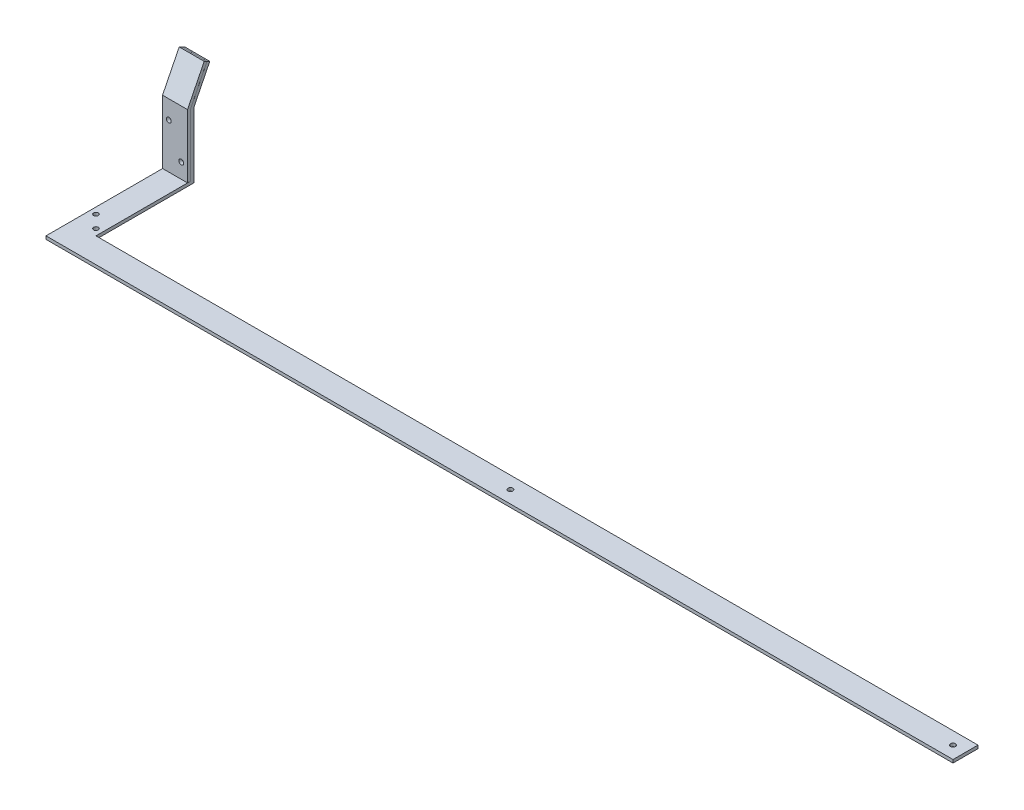
ISO-10303-21;
HEADER;
FILE_DESCRIPTION(('STEP AP214'),'2;1');
FILE_NAME('part.step','',(''),(''),'','','');
FILE_SCHEMA(('AUTOMOTIVE_DESIGN { 1 0 10303 214 1 1 1 1 }'));
ENDSEC;
DATA;
#1=APPLICATION_CONTEXT('core data for automotive mechanical design processes');
#2=APPLICATION_PROTOCOL_DEFINITION('international standard','automotive_design',2000,#1);
#3=PRODUCT_CONTEXT('',#1,'mechanical');
#4=PRODUCT('Part','Part','',(#3));
#5=PRODUCT_RELATED_PRODUCT_CATEGORY('part','',(#4));
#6=PRODUCT_DEFINITION_FORMATION('','',#4);
#7=PRODUCT_DEFINITION_CONTEXT('part definition',#1,'design');
#8=PRODUCT_DEFINITION('design','',#6,#7);
#9=PRODUCT_DEFINITION_SHAPE('','',#8);
#10=(LENGTH_UNIT() NAMED_UNIT(*) SI_UNIT(.MILLI.,.METRE.));
#11=(NAMED_UNIT(*) PLANE_ANGLE_UNIT() SI_UNIT($,.RADIAN.));
#12=(NAMED_UNIT(*) SI_UNIT($,.STERADIAN.) SOLID_ANGLE_UNIT());
#13=UNCERTAINTY_MEASURE_WITH_UNIT(LENGTH_MEASURE(1.E-05),#10,'distance_accuracy_value','');
#14=(GEOMETRIC_REPRESENTATION_CONTEXT(3) GLOBAL_UNCERTAINTY_ASSIGNED_CONTEXT((#13)) GLOBAL_UNIT_ASSIGNED_CONTEXT((#10,
#11,#12)) REPRESENTATION_CONTEXT('',''));
#15=CARTESIAN_POINT('',(0.,0.,0.));
#16=DIRECTION('',(0.,0.,1.));
#17=DIRECTION('',(1.,0.,0.));
#18=AXIS2_PLACEMENT_3D('',#15,#16,#17);
#19=CARTESIAN_POINT('',(2.08166817117217E-13,134.059354645728,6.40999999999998));
#20=DIRECTION('',(0.,-0.44619781310981,-0.894934361602024));
#21=DIRECTION('',(0.,0.894934361602024,-0.44619781310981));
#22=AXIS2_PLACEMENT_3D('',#19,#20,#21);
#23=PLANE('',#22);
#24=DIRECTION('',(0.,-0.894934361602024,0.44619781310981));
#25=VECTOR('',#24,1.);
#26=CARTESIAN_POINT('',(-50.7999999999998,134.059354645728,6.40999999999998));
#27=LINE('',#26,#25);
#28=CARTESIAN_POINT('',(-50.7999999999998,200.740336378982,-26.8359110991472));
#29=VERTEX_POINT('',#28);
#30=CARTESIAN_POINT('',(-50.7999999999998,134.059354645728,6.40999999999998));
#31=VERTEX_POINT('',#30);
#32=EDGE_CURVE('E129',#29,#31,#27,.T.);
#33=ORIENTED_EDGE('',*,*,#32,.F.);
#34=DIRECTION('',(-1.,0.,0.));
#35=VECTOR('',#34,1.);
#36=CARTESIAN_POINT('',(2.08166817117217E-13,200.740336378982,-26.8359110991472));
#37=LINE('',#36,#35);
#38=CARTESIAN_POINT('',(2.08166817117217E-13,200.740336378982,-26.8359110991472));
#39=VERTEX_POINT('',#38);
#40=EDGE_CURVE('E12',#39,#29,#37,.T.);
#41=ORIENTED_EDGE('',*,*,#40,.F.);
#42=DIRECTION('',(0.,-0.894934361602024,0.44619781310981));
#43=VECTOR('',#42,1.);
#44=CARTESIAN_POINT('',(2.08166817117217E-13,134.059354645728,6.40999999999998));
#45=LINE('',#44,#43);
#46=CARTESIAN_POINT('',(2.08166817117217E-13,134.059354645728,6.40999999999998));
#47=VERTEX_POINT('',#46);
#48=EDGE_CURVE('E143',#39,#47,#45,.T.);
#49=ORIENTED_EDGE('',*,*,#48,.T.);
#50=DIRECTION('',(-1.,0.,0.));
#51=VECTOR('',#50,1.);
#52=CARTESIAN_POINT('',(2.08166817117217E-13,134.059354645728,6.40999999999998));
#53=LINE('',#52,#51);
#54=EDGE_CURVE('E93',#47,#31,#53,.T.);
#55=ORIENTED_EDGE('',*,*,#54,.T.);
#56=EDGE_LOOP('',(#33,#41,#49,#55));
#57=FACE_BOUND('',#56,.T.);
#58=ADVANCED_FACE('F43',(#57),#23,.T.);
#59=CARTESIAN_POINT('',(2.08166817117217E-13,200.740336378982,-26.8359110991472));
#60=DIRECTION('',(0.,0.894934361602024,-0.446197813109811));
#61=DIRECTION('',(0.,0.446197813109811,0.894934361602024));
#62=AXIS2_PLACEMENT_3D('',#59,#60,#61);
#63=PLANE('',#62);
#64=DIRECTION('',(0.,-0.446197813109811,-0.894934361602024));
#65=VECTOR('',#64,1.);
#66=CARTESIAN_POINT('',(-50.7999999999998,200.740336378982,-26.8359110991472));
#67=LINE('',#66,#65);
#68=CARTESIAN_POINT('',(-50.7999999999998,203.555844579705,-21.1888752774384));
#69=VERTEX_POINT('',#68);
#70=EDGE_CURVE('E141',#69,#29,#67,.T.);
#71=ORIENTED_EDGE('',*,*,#70,.F.);
#72=DIRECTION('',(-1.,0.,0.));
#73=VECTOR('',#72,1.);
#74=CARTESIAN_POINT('',(2.08166817117217E-13,203.555844579705,-21.1888752774384));
#75=LINE('',#74,#73);
#76=CARTESIAN_POINT('',(2.08166817117217E-13,203.555844579705,-21.1888752774384));
#77=VERTEX_POINT('',#76);
#78=EDGE_CURVE('E52',#77,#69,#75,.T.);
#79=ORIENTED_EDGE('',*,*,#78,.F.);
#80=DIRECTION('',(0.,-0.446197813109811,-0.894934361602024));
#81=VECTOR('',#80,1.);
#82=CARTESIAN_POINT('',(2.08166817117217E-13,200.740336378982,-26.8359110991472));
#83=LINE('',#82,#81);
#84=EDGE_CURVE('E119',#77,#39,#83,.T.);
#85=ORIENTED_EDGE('',*,*,#84,.T.);
#86=ORIENTED_EDGE('',*,*,#40,.T.);
#87=EDGE_LOOP('',(#71,#79,#85,#86));
#88=FACE_BOUND('',#87,.T.);
#89=ADVANCED_FACE('F167',(#88),#63,.T.);
#90=CARTESIAN_POINT('',(2.08166817117217E-13,135.545162417108,12.72));
#91=DIRECTION('',(0.,0.44619781310981,0.894934361602024));
#92=DIRECTION('',(0.,-0.894934361602024,0.44619781310981));
#93=AXIS2_PLACEMENT_3D('',#90,#91,#92);
#94=PLANE('',#93);
#95=DIRECTION('',(0.,0.894934361602024,-0.44619781310981));
#96=VECTOR('',#95,1.);
#97=CARTESIAN_POINT('',(-50.7999999999998,135.545162417108,12.72));
#98=LINE('',#97,#96);
#99=CARTESIAN_POINT('',(-50.7999999999998,135.545162417108,12.72));
#100=VERTEX_POINT('',#99);
#101=EDGE_CURVE('E106',#100,#69,#98,.T.);
#102=ORIENTED_EDGE('',*,*,#101,.F.);
#103=DIRECTION('',(-1.,0.,0.));
#104=VECTOR('',#103,1.);
#105=CARTESIAN_POINT('',(2.08166817117217E-13,135.545162417108,12.72));
#106=LINE('',#105,#104);
#107=CARTESIAN_POINT('',(2.08166817117217E-13,135.545162417108,12.72));
#108=VERTEX_POINT('',#107);
#109=EDGE_CURVE('E101',#108,#100,#106,.T.);
#110=ORIENTED_EDGE('',*,*,#109,.F.);
#111=DIRECTION('',(0.,0.894934361602024,-0.44619781310981));
#112=VECTOR('',#111,1.);
#113=CARTESIAN_POINT('',(2.08166817117217E-13,135.545162417108,12.72));
#114=LINE('',#113,#112);
#115=EDGE_CURVE('E104',#108,#77,#114,.T.);
#116=ORIENTED_EDGE('',*,*,#115,.T.);
#117=ORIENTED_EDGE('',*,*,#78,.T.);
#118=EDGE_LOOP('',(#102,#110,#116,#117));
#119=FACE_BOUND('',#118,.T.);
#120=ADVANCED_FACE('F103',(#119),#94,.T.);
#121=CARTESIAN_POINT('',(2.08166817117217E-13,6.41,12.72));
#122=DIRECTION('',(0.,0.,1.));
#123=DIRECTION('',(0.,-1.,0.));
#124=AXIS2_PLACEMENT_3D('',#121,#122,#123);
#125=PLANE('',#124);
#126=CARTESIAN_POINT('',(-38.0999999999998,98.1,12.72));
#127=DIRECTION('',(0.,0.,1.));
#128=DIRECTION('',(1.,0.,0.));
#129=AXIS2_PLACEMENT_3D('',#126,#127,#128);
#130=CIRCLE('',#129,5.);
#131=CARTESIAN_POINT('',(-33.0999999999998,98.1,12.72));
#132=VERTEX_POINT('',#131);
#133=EDGE_CURVE('E151',#132,#132,#130,.T.);
#134=ORIENTED_EDGE('',*,*,#133,.F.);
#135=EDGE_LOOP('',(#134));
#136=FACE_BOUND('',#135,.T.);
#137=CARTESIAN_POINT('',(-12.6999999999998,36.91,12.72));
#138=DIRECTION('',(0.,0.,1.));
#139=DIRECTION('',(1.,0.,0.));
#140=AXIS2_PLACEMENT_3D('',#137,#138,#139);
#141=CIRCLE('',#140,5.);
#142=CARTESIAN_POINT('',(-7.69999999999979,36.91,12.72));
#143=VERTEX_POINT('',#142);
#144=EDGE_CURVE('E156',#143,#143,#141,.T.);
#145=ORIENTED_EDGE('',*,*,#144,.F.);
#146=EDGE_LOOP('',(#145));
#147=FACE_BOUND('',#146,.T.);
#148=DIRECTION('',(0.,1.,0.));
#149=VECTOR('',#148,1.);
#150=CARTESIAN_POINT('',(-50.7999999999998,6.41,12.72));
#151=LINE('',#150,#149);
#152=CARTESIAN_POINT('',(-50.7999999999998,6.41,12.72));
#153=VERTEX_POINT('',#152);
#154=EDGE_CURVE('E138',#153,#100,#151,.T.);
#155=ORIENTED_EDGE('',*,*,#154,.F.);
#156=DIRECTION('',(-1.,0.,0.));
#157=VECTOR('',#156,1.);
#158=CARTESIAN_POINT('',(2.08166817117217E-13,6.41,12.72));
#159=LINE('',#158,#157);
#160=CARTESIAN_POINT('',(2.08166817117217E-13,6.41,12.72));
#161=VERTEX_POINT('',#160);
#162=EDGE_CURVE('E111',#161,#153,#159,.T.);
#163=ORIENTED_EDGE('',*,*,#162,.F.);
#164=DIRECTION('',(0.,1.,0.));
#165=VECTOR('',#164,1.);
#166=CARTESIAN_POINT('',(2.08166817117217E-13,6.41,12.72));
#167=LINE('',#166,#165);
#168=EDGE_CURVE('E117',#161,#108,#167,.T.);
#169=ORIENTED_EDGE('',*,*,#168,.T.);
#170=ORIENTED_EDGE('',*,*,#109,.T.);
#171=EDGE_LOOP('',(#155,#163,#169,#170));
#172=FACE_BOUND('',#171,.T.);
#173=ADVANCED_FACE('F121',(#136,#147,#172),#125,.T.);
#174=CARTESIAN_POINT('',(2.08166817117217E-13,6.41,6.41));
#175=DIRECTION('',(0.,-1.,0.));
#176=DIRECTION('',(0.,0.,-1.));
#177=AXIS2_PLACEMENT_3D('',#174,#175,#176);
#178=PLANE('',#177);
#179=DIRECTION('',(0.,0.,1.));
#180=VECTOR('',#179,1.);
#181=CARTESIAN_POINT('',(-50.7999999999998,6.41,6.41));
#182=LINE('',#181,#180);
#183=CARTESIAN_POINT('',(-50.7999999999998,6.41,6.41));
#184=VERTEX_POINT('',#183);
#185=EDGE_CURVE('E135',#184,#153,#182,.T.);
#186=ORIENTED_EDGE('',*,*,#185,.F.);
#187=DIRECTION('',(-1.,0.,0.));
#188=VECTOR('',#187,1.);
#189=CARTESIAN_POINT('',(2.08166817117217E-13,6.41,6.41));
#190=LINE('',#189,#188);
#191=CARTESIAN_POINT('',(2.08166817117217E-13,6.41,6.41));
#192=VERTEX_POINT('',#191);
#193=EDGE_CURVE('E147',#192,#184,#190,.T.);
#194=ORIENTED_EDGE('',*,*,#193,.F.);
#195=DIRECTION('',(0.,0.,1.));
#196=VECTOR('',#195,1.);
#197=CARTESIAN_POINT('',(2.08166817117217E-13,6.41,6.41));
#198=LINE('',#197,#196);
#199=EDGE_CURVE('E122',#192,#161,#198,.T.);
#200=ORIENTED_EDGE('',*,*,#199,.T.);
#201=ORIENTED_EDGE('',*,*,#162,.T.);
#202=EDGE_LOOP('',(#186,#194,#200,#201));
#203=FACE_BOUND('',#202,.T.);
#204=ADVANCED_FACE('F180',(#203),#178,.T.);
#205=CARTESIAN_POINT('',(2.08166817117217E-13,6.41,6.41));
#206=DIRECTION('',(0.,0.,-1.));
#207=DIRECTION('',(0.,1.,0.));
#208=AXIS2_PLACEMENT_3D('',#205,#206,#207);
#209=PLANE('',#208);
#210=CARTESIAN_POINT('',(-38.0999999999998,98.1,6.40999999999999));
#211=DIRECTION('',(0.,0.,-1.));
#212=DIRECTION('',(0.,1.,0.));
#213=AXIS2_PLACEMENT_3D('',#210,#211,#212);
#214=CIRCLE('',#213,5.);
#215=CARTESIAN_POINT('',(-38.0999999999998,103.1,6.40999999999999));
#216=VERTEX_POINT('',#215);
#217=EDGE_CURVE('E46',#216,#216,#214,.T.);
#218=ORIENTED_EDGE('',*,*,#217,.F.);
#219=EDGE_LOOP('',(#218));
#220=FACE_BOUND('',#219,.T.);
#221=CARTESIAN_POINT('',(-12.6999999999998,36.91,6.41));
#222=DIRECTION('',(0.,0.,-1.));
#223=DIRECTION('',(0.,1.,0.));
#224=AXIS2_PLACEMENT_3D('',#221,#222,#223);
#225=CIRCLE('',#224,5.);
#226=CARTESIAN_POINT('',(-12.6999999999998,41.91,6.41));
#227=VERTEX_POINT('',#226);
#228=EDGE_CURVE('E149',#227,#227,#225,.T.);
#229=ORIENTED_EDGE('',*,*,#228,.F.);
#230=EDGE_LOOP('',(#229));
#231=FACE_BOUND('',#230,.T.);
#232=DIRECTION('',(0.,-1.,0.));
#233=VECTOR('',#232,1.);
#234=CARTESIAN_POINT('',(-50.7999999999998,6.41,6.41));
#235=LINE('',#234,#233);
#236=EDGE_CURVE('E132',#31,#184,#235,.T.);
#237=ORIENTED_EDGE('',*,*,#236,.F.);
#238=ORIENTED_EDGE('',*,*,#54,.F.);
#239=DIRECTION('',(0.,-1.,0.));
#240=VECTOR('',#239,1.);
#241=CARTESIAN_POINT('',(2.08166817117217E-13,6.41,6.41));
#242=LINE('',#241,#240);
#243=EDGE_CURVE('E124',#47,#192,#242,.T.);
#244=ORIENTED_EDGE('',*,*,#243,.T.);
#245=ORIENTED_EDGE('',*,*,#193,.T.);
#246=EDGE_LOOP('',(#237,#238,#244,#245));
#247=FACE_BOUND('',#246,.T.);
#248=ADVANCED_FACE('F163',(#220,#231,#247),#209,.T.);
#249=CARTESIAN_POINT('',(2.08166817117217E-13,0.,0.));
#250=DIRECTION('',(1.,0.,0.));
#251=DIRECTION('',(0.,0.,-1.));
#252=AXIS2_PLACEMENT_3D('',#249,#250,#251);
#253=PLANE('',#252);
#254=ORIENTED_EDGE('',*,*,#48,.F.);
#255=ORIENTED_EDGE('',*,*,#84,.F.);
#256=ORIENTED_EDGE('',*,*,#115,.F.);
#257=ORIENTED_EDGE('',*,*,#168,.F.);
#258=ORIENTED_EDGE('',*,*,#199,.F.);
#259=ORIENTED_EDGE('',*,*,#243,.F.);
#260=EDGE_LOOP('',(#254,#255,#256,#257,#258,#259));
#261=FACE_BOUND('',#260,.T.);
#262=ADVANCED_FACE('F115',(#261),#253,.T.);
#263=CARTESIAN_POINT('',(-50.7999999999998,0.,0.));
#264=DIRECTION('',(1.,0.,0.));
#265=DIRECTION('',(0.,0.,-1.));
#266=AXIS2_PLACEMENT_3D('',#263,#264,#265);
#267=PLANE('',#266);
#268=ORIENTED_EDGE('',*,*,#32,.T.);
#269=ORIENTED_EDGE('',*,*,#236,.T.);
#270=ORIENTED_EDGE('',*,*,#185,.T.);
#271=ORIENTED_EDGE('',*,*,#154,.T.);
#272=ORIENTED_EDGE('',*,*,#101,.T.);
#273=ORIENTED_EDGE('',*,*,#70,.T.);
#274=EDGE_LOOP('',(#268,#269,#270,#271,#272,#273));
#275=FACE_BOUND('',#274,.T.);
#276=ADVANCED_FACE('F166',(#275),#267,.F.);
#277=CARTESIAN_POINT('',(-12.6999999999998,36.91,-11.28));
#278=DIRECTION('',(0.,0.,1.));
#279=DIRECTION('',(1.,0.,0.));
#280=AXIS2_PLACEMENT_3D('',#277,#278,#279);
#281=CYLINDRICAL_SURFACE('',#280,5.);
#282=ORIENTED_EDGE('',*,*,#228,.T.);
#283=EDGE_LOOP('',(#282));
#284=FACE_BOUND('',#283,.T.);
#285=ORIENTED_EDGE('',*,*,#144,.T.);
#286=EDGE_LOOP('',(#285));
#287=FACE_BOUND('',#286,.T.);
#288=ADVANCED_FACE('F194',(#284,#287),#281,.F.);
#289=CARTESIAN_POINT('',(-38.0999999999998,98.1,-11.28));
#290=DIRECTION('',(0.,0.,1.));
#291=DIRECTION('',(1.,0.,0.));
#292=AXIS2_PLACEMENT_3D('',#289,#290,#291);
#293=CYLINDRICAL_SURFACE('',#292,5.);
#294=ORIENTED_EDGE('',*,*,#217,.T.);
#295=EDGE_LOOP('',(#294));
#296=FACE_BOUND('',#295,.T.);
#297=ORIENTED_EDGE('',*,*,#133,.T.);
#298=EDGE_LOOP('',(#297));
#299=FACE_BOUND('',#298,.T.);
#300=ADVANCED_FACE('F192',(#296,#299),#293,.F.);
#301=CLOSED_SHELL('',(#58,#89,#120,#173,#204,#248,#262,#276,#288,#300));
#302=MANIFOLD_SOLID_BREP('B2',#301);
#303=CARTESIAN_POINT('',(-1.11022302462516E-13,6.31,198.902795));
#304=DIRECTION('',(0.,0.,1.));
#305=DIRECTION('',(1.,0.,0.));
#306=AXIS2_PLACEMENT_3D('',#303,#304,#305);
#307=PLANE('',#306);
#308=DIRECTION('',(-1.,0.,0.));
#309=VECTOR('',#308,1.);
#310=CARTESIAN_POINT('',(-1.11022302462516E-13,0.,198.902795));
#311=LINE('',#310,#309);
#312=CARTESIAN_POINT('',(1793.65,0.,198.902794999999));
#313=VERTEX_POINT('',#312);
#314=CARTESIAN_POINT('',(-1.11022302462516E-13,0.,198.902795));
#315=VERTEX_POINT('',#314);
#316=EDGE_CURVE('E413',#313,#315,#311,.T.);
#317=ORIENTED_EDGE('',*,*,#316,.T.);
#318=DIRECTION('',(0.,-1.,0.));
#319=VECTOR('',#318,1.);
#320=CARTESIAN_POINT('',(-1.11022302462516E-13,6.31,198.902795));
#321=LINE('',#320,#319);
#322=CARTESIAN_POINT('',(-1.11022302462516E-13,6.31,198.902795));
#323=VERTEX_POINT('',#322);
#324=EDGE_CURVE('E41',#323,#315,#321,.T.);
#325=ORIENTED_EDGE('',*,*,#324,.F.);
#326=DIRECTION('',(-1.,0.,0.));
#327=VECTOR('',#326,1.);
#328=CARTESIAN_POINT('',(-1.11022302462516E-13,6.31,198.902795));
#329=LINE('',#328,#327);
#330=CARTESIAN_POINT('',(1793.65,6.31,198.902794999999));
#331=VERTEX_POINT('',#330);
#332=EDGE_CURVE('E332',#331,#323,#329,.T.);
#333=ORIENTED_EDGE('',*,*,#332,.F.);
#334=DIRECTION('',(0.,1.,0.));
#335=VECTOR('',#334,1.);
#336=CARTESIAN_POINT('',(1793.65,6.31,198.902794999999));
#337=LINE('',#336,#335);
#338=EDGE_CURVE('E382',#313,#331,#337,.T.);
#339=ORIENTED_EDGE('',*,*,#338,.F.);
#340=EDGE_LOOP('',(#317,#325,#333,#339));
#341=FACE_BOUND('',#340,.T.);
#342=ADVANCED_FACE('F261',(#341),#307,.F.);
#343=CARTESIAN_POINT('',(0.,6.31,0.));
#344=DIRECTION('',(-1.,0.,0.));
#345=DIRECTION('',(0.,0.,1.));
#346=AXIS2_PLACEMENT_3D('',#343,#344,#345);
#347=PLANE('',#346);
#348=DIRECTION('',(0.,0.,-1.));
#349=VECTOR('',#348,1.);
#350=CARTESIAN_POINT('',(0.,0.,0.));
#351=LINE('',#350,#349);
#352=CARTESIAN_POINT('',(0.,0.,0.));
#353=VERTEX_POINT('',#352);
#354=EDGE_CURVE('E429',#315,#353,#351,.T.);
#355=ORIENTED_EDGE('',*,*,#354,.T.);
#356=DIRECTION('',(0.,-1.,0.));
#357=VECTOR('',#356,1.);
#358=CARTESIAN_POINT('',(0.,6.31,0.));
#359=LINE('',#358,#357);
#360=CARTESIAN_POINT('',(2.08166817117217E-13,132.55,0.));
#361=VERTEX_POINT('',#360);
#362=EDGE_CURVE('E269',#361,#353,#359,.T.);
#363=ORIENTED_EDGE('',*,*,#362,.F.);
#364=DIRECTION('',(0.,-0.894934361602024,0.446197813109811));
#365=VECTOR('',#364,1.);
#366=CARTESIAN_POINT('',(2.08166817117217E-13,132.55,0.));
#367=LINE('',#366,#365);
#368=CARTESIAN_POINT('',(2.08166817117217E-13,197.880208396948,-32.5724403570162));
#369=VERTEX_POINT('',#368);
#370=EDGE_CURVE('E398',#369,#361,#367,.T.);
#371=ORIENTED_EDGE('',*,*,#370,.F.);
#372=DIRECTION('',(0.,-0.44619781310981,-0.894934361602024));
#373=VECTOR('',#372,1.);
#374=CARTESIAN_POINT('',(2.08166817117217E-13,197.880208396948,-32.5724403570162));
#375=LINE('',#374,#373);
#376=CARTESIAN_POINT('',(2.08166817117217E-13,200.695716597671,-26.9254045353074));
#377=VERTEX_POINT('',#376);
#378=EDGE_CURVE('E395',#377,#369,#375,.T.);
#379=ORIENTED_EDGE('',*,*,#378,.F.);
#380=DIRECTION('',(0.,0.894934361602024,-0.44619781310981));
#381=VECTOR('',#380,1.);
#382=CARTESIAN_POINT('',(2.08166817117217E-13,134.03580777138,6.30999999999997));
#383=LINE('',#382,#381);
#384=CARTESIAN_POINT('',(2.08166817117217E-13,134.03580777138,6.30999999999997));
#385=VERTEX_POINT('',#384);
#386=EDGE_CURVE('E391',#385,#377,#383,.T.);
#387=ORIENTED_EDGE('',*,*,#386,.F.);
#388=DIRECTION('',(0.,1.,0.));
#389=VECTOR('',#388,1.);
#390=CARTESIAN_POINT('',(2.08166817117217E-13,6.31,6.30999999999999));
#391=LINE('',#390,#389);
#392=CARTESIAN_POINT('',(2.08166817117217E-13,6.31,6.30999999999999));
#393=VERTEX_POINT('',#392);
#394=EDGE_CURVE('E388',#393,#385,#391,.T.);
#395=ORIENTED_EDGE('',*,*,#394,.F.);
#396=DIRECTION('',(0.,0.,-1.));
#397=VECTOR('',#396,1.);
#398=CARTESIAN_POINT('',(0.,6.31,0.));
#399=LINE('',#398,#397);
#400=EDGE_CURVE('E335',#323,#393,#399,.T.);
#401=ORIENTED_EDGE('',*,*,#400,.F.);
#402=ORIENTED_EDGE('',*,*,#324,.T.);
#403=EDGE_LOOP('',(#355,#363,#371,#379,#387,#395,#401,#402));
#404=FACE_BOUND('',#403,.T.);
#405=ADVANCED_FACE('F438',(#404),#347,.F.);
#406=CARTESIAN_POINT('',(-50.7999999999998,6.31,0.));
#407=DIRECTION('',(0.,0.,1.));
#408=DIRECTION('',(1.,0.,0.));
#409=AXIS2_PLACEMENT_3D('',#406,#407,#408);
#410=PLANE('',#409);
#411=CARTESIAN_POINT('',(-38.0999999999998,98.1,0.));
#412=DIRECTION('',(0.,0.,1.));
#413=DIRECTION('',(1.,0.,0.));
#414=AXIS2_PLACEMENT_3D('',#411,#412,#413);
#415=CIRCLE('',#414,5.);
#416=CARTESIAN_POINT('',(-33.0999999999998,98.1,0.));
#417=VERTEX_POINT('',#416);
#418=EDGE_CURVE('E351',#417,#417,#415,.T.);
#419=ORIENTED_EDGE('',*,*,#418,.T.);
#420=EDGE_LOOP('',(#419));
#421=FACE_BOUND('',#420,.T.);
#422=CARTESIAN_POINT('',(-12.6999999999998,36.91,0.));
#423=DIRECTION('',(0.,0.,1.));
#424=DIRECTION('',(1.,0.,0.));
#425=AXIS2_PLACEMENT_3D('',#422,#423,#424);
#426=CIRCLE('',#425,5.);
#427=CARTESIAN_POINT('',(-7.69999999999979,36.91,0.));
#428=VERTEX_POINT('',#427);
#429=EDGE_CURVE('E343',#428,#428,#426,.T.);
#430=ORIENTED_EDGE('',*,*,#429,.T.);
#431=EDGE_LOOP('',(#430));
#432=FACE_BOUND('',#431,.T.);
#433=DIRECTION('',(-1.,0.,0.));
#434=VECTOR('',#433,1.);
#435=CARTESIAN_POINT('',(-50.7999999999998,0.,0.));
#436=LINE('',#435,#434);
#437=CARTESIAN_POINT('',(-50.7999999999998,0.,0.));
#438=VERTEX_POINT('',#437);
#439=EDGE_CURVE('E317',#353,#438,#436,.T.);
#440=ORIENTED_EDGE('',*,*,#439,.T.);
#441=DIRECTION('',(0.,-1.,0.));
#442=VECTOR('',#441,1.);
#443=CARTESIAN_POINT('',(-50.7999999999998,6.31,0.));
#444=LINE('',#443,#442);
#445=CARTESIAN_POINT('',(-50.7999999999998,132.55,0.));
#446=VERTEX_POINT('',#445);
#447=EDGE_CURVE('E312',#446,#438,#444,.T.);
#448=ORIENTED_EDGE('',*,*,#447,.F.);
#449=DIRECTION('',(-1.,0.,0.));
#450=VECTOR('',#449,1.);
#451=CARTESIAN_POINT('',(2.08166817117217E-13,132.55,0.));
#452=LINE('',#451,#450);
#453=EDGE_CURVE('E410',#361,#446,#452,.T.);
#454=ORIENTED_EDGE('',*,*,#453,.F.);
#455=ORIENTED_EDGE('',*,*,#362,.T.);
#456=EDGE_LOOP('',(#440,#448,#454,#455));
#457=FACE_BOUND('',#456,.T.);
#458=ADVANCED_FACE('F431',(#421,#432,#457),#410,.F.);
#459=CARTESIAN_POINT('',(-50.7999999999998,6.31,249.702795));
#460=DIRECTION('',(1.,0.,0.));
#461=DIRECTION('',(0.,0.,-1.));
#462=AXIS2_PLACEMENT_3D('',#459,#460,#461);
#463=PLANE('',#462);
#464=DIRECTION('',(0.,0.,1.));
#465=VECTOR('',#464,1.);
#466=CARTESIAN_POINT('',(-50.7999999999998,0.,249.702795));
#467=LINE('',#466,#465);
#468=CARTESIAN_POINT('',(-50.7999999999998,0.,249.702795));
#469=VERTEX_POINT('',#468);
#470=EDGE_CURVE('E305',#438,#469,#467,.T.);
#471=ORIENTED_EDGE('',*,*,#470,.T.);
#472=DIRECTION('',(0.,-1.,0.));
#473=VECTOR('',#472,1.);
#474=CARTESIAN_POINT('',(-50.7999999999998,6.31,249.702795));
#475=LINE('',#474,#473);
#476=CARTESIAN_POINT('',(-50.7999999999998,6.31,249.702795));
#477=VERTEX_POINT('',#476);
#478=EDGE_CURVE('E308',#477,#469,#475,.T.);
#479=ORIENTED_EDGE('',*,*,#478,.F.);
#480=DIRECTION('',(0.,0.,1.));
#481=VECTOR('',#480,1.);
#482=CARTESIAN_POINT('',(-50.7999999999998,6.31,249.702795));
#483=LINE('',#482,#481);
#484=CARTESIAN_POINT('',(-50.7999999999998,6.31,6.30999999999998));
#485=VERTEX_POINT('',#484);
#486=EDGE_CURVE('E285',#485,#477,#483,.T.);
#487=ORIENTED_EDGE('',*,*,#486,.F.);
#488=DIRECTION('',(0.,1.,0.));
#489=VECTOR('',#488,1.);
#490=CARTESIAN_POINT('',(-50.7999999999998,6.31,6.30999999999999));
#491=LINE('',#490,#489);
#492=CARTESIAN_POINT('',(-50.7999999999998,134.03580777138,6.30999999999997));
#493=VERTEX_POINT('',#492);
#494=EDGE_CURVE('E277',#485,#493,#491,.T.);
#495=ORIENTED_EDGE('',*,*,#494,.T.);
#496=DIRECTION('',(0.,0.894934361602024,-0.44619781310981));
#497=VECTOR('',#496,1.);
#498=CARTESIAN_POINT('',(-50.7999999999998,134.03580777138,6.30999999999997));
#499=LINE('',#498,#497);
#500=CARTESIAN_POINT('',(-50.7999999999998,200.695716597671,-26.9254045353074));
#501=VERTEX_POINT('',#500);
#502=EDGE_CURVE('E403',#493,#501,#499,.T.);
#503=ORIENTED_EDGE('',*,*,#502,.T.);
#504=DIRECTION('',(0.,-0.44619781310981,-0.894934361602024));
#505=VECTOR('',#504,1.);
#506=CARTESIAN_POINT('',(-50.7999999999998,197.880208396948,-32.5724403570162));
#507=LINE('',#506,#505);
#508=CARTESIAN_POINT('',(-50.7999999999998,197.880208396948,-32.5724403570162));
#509=VERTEX_POINT('',#508);
#510=EDGE_CURVE('E406',#501,#509,#507,.T.);
#511=ORIENTED_EDGE('',*,*,#510,.T.);
#512=DIRECTION('',(0.,-0.894934361602024,0.446197813109811));
#513=VECTOR('',#512,1.);
#514=CARTESIAN_POINT('',(-50.7999999999998,132.55,0.));
#515=LINE('',#514,#513);
#516=EDGE_CURVE('E392',#509,#446,#515,.T.);
#517=ORIENTED_EDGE('',*,*,#516,.T.);
#518=ORIENTED_EDGE('',*,*,#447,.T.);
#519=EDGE_LOOP('',(#471,#479,#487,#495,#503,#511,#517,#518));
#520=FACE_BOUND('',#519,.T.);
#521=ADVANCED_FACE('F307',(#520),#463,.F.);
#522=CARTESIAN_POINT('',(1742.85,6.31,249.702795));
#523=DIRECTION('',(0.,0.,-1.));
#524=DIRECTION('',(-1.,0.,0.));
#525=AXIS2_PLACEMENT_3D('',#522,#523,#524);
#526=PLANE('',#525);
#527=DIRECTION('',(1.,0.,0.));
#528=VECTOR('',#527,1.);
#529=CARTESIAN_POINT('',(1742.85,0.,249.702795));
#530=LINE('',#529,#528);
#531=CARTESIAN_POINT('',(1793.65,0.,249.702795));
#532=VERTEX_POINT('',#531);
#533=EDGE_CURVE('E316',#469,#532,#530,.T.);
#534=ORIENTED_EDGE('',*,*,#533,.T.);
#535=DIRECTION('',(0.,-1.,0.));
#536=VECTOR('',#535,1.);
#537=CARTESIAN_POINT('',(1793.65,0.,249.702795));
#538=LINE('',#537,#536);
#539=CARTESIAN_POINT('',(1793.65,6.31,249.702795));
#540=VERTEX_POINT('',#539);
#541=EDGE_CURVE('E379',#540,#532,#538,.T.);
#542=ORIENTED_EDGE('',*,*,#541,.F.);
#543=DIRECTION('',(1.,0.,0.));
#544=VECTOR('',#543,1.);
#545=CARTESIAN_POINT('',(1742.85,6.31,249.702795));
#546=LINE('',#545,#544);
#547=EDGE_CURVE('E325',#477,#540,#546,.T.);
#548=ORIENTED_EDGE('',*,*,#547,.F.);
#549=ORIENTED_EDGE('',*,*,#478,.T.);
#550=EDGE_LOOP('',(#534,#542,#548,#549));
#551=FACE_BOUND('',#550,.T.);
#552=ADVANCED_FACE('F321',(#551),#526,.F.);
#553=CARTESIAN_POINT('',(0.,6.31,0.));
#554=DIRECTION('',(0.,-1.,0.));
#555=DIRECTION('',(0.,0.,-1.));
#556=AXIS2_PLACEMENT_3D('',#553,#554,#555);
#557=PLANE('',#556);
#558=CARTESIAN_POINT('',(1768.25,6.31,224.302795000003));
#559=DIRECTION('',(0.,-1.,0.));
#560=DIRECTION('',(0.,0.,-1.));
#561=AXIS2_PLACEMENT_3D('',#558,#559,#560);
#562=CIRCLE('',#561,4.99999999998284);
#563=CARTESIAN_POINT('',(1768.25,6.31,219.30279500002));
#564=VERTEX_POINT('',#563);
#565=EDGE_CURVE('E358',#564,#564,#562,.T.);
#566=ORIENTED_EDGE('',*,*,#565,.T.);
#567=EDGE_LOOP('',(#566));
#568=FACE_BOUND('',#567,.T.);
#569=CARTESIAN_POINT('',(868.250000079005,6.31,224.302795000015));
#570=DIRECTION('',(0.,-1.,0.));
#571=DIRECTION('',(0.,0.,-1.));
#572=AXIS2_PLACEMENT_3D('',#569,#570,#571);
#573=CIRCLE('',#572,4.99999999995429);
#574=CARTESIAN_POINT('',(868.250000079005,6.31,219.302795000061));
#575=VERTEX_POINT('',#574);
#576=EDGE_CURVE('E364',#575,#575,#573,.T.);
#577=ORIENTED_EDGE('',*,*,#576,.T.);
#578=EDGE_LOOP('',(#577));
#579=FACE_BOUND('',#578,.T.);
#580=CARTESIAN_POINT('',(-12.6999999999999,6.31,186.202795000003));
#581=DIRECTION('',(0.,-1.,0.));
#582=DIRECTION('',(0.,0.,-1.));
#583=AXIS2_PLACEMENT_3D('',#580,#581,#582);
#584=CIRCLE('',#583,4.76249999999787);
#585=CARTESIAN_POINT('',(-12.6999999999999,6.31,181.440295000006));
#586=VERTEX_POINT('',#585);
#587=EDGE_CURVE('E370',#586,#586,#584,.T.);
#588=ORIENTED_EDGE('',*,*,#587,.T.);
#589=EDGE_LOOP('',(#588));
#590=FACE_BOUND('',#589,.T.);
#591=CARTESIAN_POINT('',(-38.1000000000002,6.31,160.802795000003));
#592=DIRECTION('',(0.,-1.,0.));
#593=DIRECTION('',(0.,0.,-1.));
#594=AXIS2_PLACEMENT_3D('',#591,#592,#593);
#595=CIRCLE('',#594,4.76249999999787);
#596=CARTESIAN_POINT('',(-38.1000000000002,6.31,156.040295000006));
#597=VERTEX_POINT('',#596);
#598=EDGE_CURVE('E376',#597,#597,#595,.T.);
#599=ORIENTED_EDGE('',*,*,#598,.T.);
#600=EDGE_LOOP('',(#599));
#601=FACE_BOUND('',#600,.T.);
#602=ORIENTED_EDGE('',*,*,#400,.T.);
#603=DIRECTION('',(-1.,0.,0.));
#604=VECTOR('',#603,1.);
#605=CARTESIAN_POINT('',(2.08166817117217E-13,6.31,6.30999999999999));
#606=LINE('',#605,#604);
#607=EDGE_CURVE('E401',#393,#485,#606,.T.);
#608=ORIENTED_EDGE('',*,*,#607,.T.);
#609=ORIENTED_EDGE('',*,*,#486,.T.);
#610=ORIENTED_EDGE('',*,*,#547,.T.);
#611=DIRECTION('',(0.,0.,1.));
#612=VECTOR('',#611,1.);
#613=CARTESIAN_POINT('',(1793.65,6.31,249.702795));
#614=LINE('',#613,#612);
#615=EDGE_CURVE('E385',#331,#540,#614,.T.);
#616=ORIENTED_EDGE('',*,*,#615,.F.);
#617=ORIENTED_EDGE('',*,*,#332,.T.);
#618=EDGE_LOOP('',(#602,#608,#609,#610,#616,#617));
#619=FACE_BOUND('',#618,.T.);
#620=ADVANCED_FACE('F450',(#568,#579,#590,#601,#619),#557,.F.);
#621=CARTESIAN_POINT('',(0.,0.,0.));
#622=DIRECTION('',(0.,-1.,0.));
#623=DIRECTION('',(0.,0.,-1.));
#624=AXIS2_PLACEMENT_3D('',#621,#622,#623);
#625=PLANE('',#624);
#626=CARTESIAN_POINT('',(1768.25,0.,224.302795000003));
#627=DIRECTION('',(0.,-1.,0.));
#628=DIRECTION('',(0.,0.,-1.));
#629=AXIS2_PLACEMENT_3D('',#626,#627,#628);
#630=CIRCLE('',#629,4.99999999998284);
#631=CARTESIAN_POINT('',(1768.25,0.,219.30279500002));
#632=VERTEX_POINT('',#631);
#633=EDGE_CURVE('E355',#632,#632,#630,.T.);
#634=ORIENTED_EDGE('',*,*,#633,.F.);
#635=EDGE_LOOP('',(#634));
#636=FACE_BOUND('',#635,.T.);
#637=CARTESIAN_POINT('',(868.250000079005,0.,224.302795000015));
#638=DIRECTION('',(0.,-1.,0.));
#639=DIRECTION('',(0.,0.,-1.));
#640=AXIS2_PLACEMENT_3D('',#637,#638,#639);
#641=CIRCLE('',#640,4.99999999995429);
#642=CARTESIAN_POINT('',(868.250000079005,0.,219.302795000061));
#643=VERTEX_POINT('',#642);
#644=EDGE_CURVE('E361',#643,#643,#641,.T.);
#645=ORIENTED_EDGE('',*,*,#644,.F.);
#646=EDGE_LOOP('',(#645));
#647=FACE_BOUND('',#646,.T.);
#648=CARTESIAN_POINT('',(-12.6999999999999,0.,186.202795000003));
#649=DIRECTION('',(0.,-1.,0.));
#650=DIRECTION('',(0.,0.,-1.));
#651=AXIS2_PLACEMENT_3D('',#648,#649,#650);
#652=CIRCLE('',#651,4.76249999999787);
#653=CARTESIAN_POINT('',(-12.6999999999999,0.,181.440295000006));
#654=VERTEX_POINT('',#653);
#655=EDGE_CURVE('E367',#654,#654,#652,.T.);
#656=ORIENTED_EDGE('',*,*,#655,.F.);
#657=EDGE_LOOP('',(#656));
#658=FACE_BOUND('',#657,.T.);
#659=CARTESIAN_POINT('',(-38.1000000000002,0.,160.802795000003));
#660=DIRECTION('',(0.,-1.,0.));
#661=DIRECTION('',(0.,0.,-1.));
#662=AXIS2_PLACEMENT_3D('',#659,#660,#661);
#663=CIRCLE('',#662,4.76249999999787);
#664=CARTESIAN_POINT('',(-38.1000000000002,0.,156.040295000006));
#665=VERTEX_POINT('',#664);
#666=EDGE_CURVE('E373',#665,#665,#663,.T.);
#667=ORIENTED_EDGE('',*,*,#666,.F.);
#668=EDGE_LOOP('',(#667));
#669=FACE_BOUND('',#668,.T.);
#670=ORIENTED_EDGE('',*,*,#316,.F.);
#671=DIRECTION('',(0.,0.,-1.));
#672=VECTOR('',#671,1.);
#673=CARTESIAN_POINT('',(1793.65,0.,198.902794999999));
#674=LINE('',#673,#672);
#675=EDGE_CURVE('E330',#532,#313,#674,.T.);
#676=ORIENTED_EDGE('',*,*,#675,.F.);
#677=ORIENTED_EDGE('',*,*,#533,.F.);
#678=ORIENTED_EDGE('',*,*,#470,.F.);
#679=ORIENTED_EDGE('',*,*,#439,.F.);
#680=ORIENTED_EDGE('',*,*,#354,.F.);
#681=EDGE_LOOP('',(#670,#676,#677,#678,#679,#680));
#682=FACE_BOUND('',#681,.T.);
#683=ADVANCED_FACE('F328',(#636,#647,#658,#669,#682),#625,.T.);
#684=CARTESIAN_POINT('',(2.08166817117217E-13,132.55,0.));
#685=DIRECTION('',(0.,-0.44619781310981,-0.894934361602024));
#686=DIRECTION('',(0.,0.894934361602024,-0.446197813109811));
#687=AXIS2_PLACEMENT_3D('',#684,#685,#686);
#688=PLANE('',#687);
#689=ORIENTED_EDGE('',*,*,#516,.F.);
#690=DIRECTION('',(-1.,0.,0.));
#691=VECTOR('',#690,1.);
#692=CARTESIAN_POINT('',(2.08166817117217E-13,197.880208396948,-32.5724403570162));
#693=LINE('',#692,#691);
#694=EDGE_CURVE('E414',#369,#509,#693,.T.);
#695=ORIENTED_EDGE('',*,*,#694,.F.);
#696=ORIENTED_EDGE('',*,*,#370,.T.);
#697=ORIENTED_EDGE('',*,*,#453,.T.);
#698=EDGE_LOOP('',(#689,#695,#696,#697));
#699=FACE_BOUND('',#698,.T.);
#700=ADVANCED_FACE('F477',(#699),#688,.T.);
#701=CARTESIAN_POINT('',(2.08166817117217E-13,197.880208396948,-32.5724403570162));
#702=DIRECTION('',(0.,0.894934361602024,-0.44619781310981));
#703=DIRECTION('',(0.,0.44619781310981,0.894934361602024));
#704=AXIS2_PLACEMENT_3D('',#701,#702,#703);
#705=PLANE('',#704);
#706=ORIENTED_EDGE('',*,*,#510,.F.);
#707=DIRECTION('',(-1.,0.,0.));
#708=VECTOR('',#707,1.);
#709=CARTESIAN_POINT('',(2.08166817117217E-13,200.695716597671,-26.9254045353074));
#710=LINE('',#709,#708);
#711=EDGE_CURVE('E417',#377,#501,#710,.T.);
#712=ORIENTED_EDGE('',*,*,#711,.F.);
#713=ORIENTED_EDGE('',*,*,#378,.T.);
#714=ORIENTED_EDGE('',*,*,#694,.T.);
#715=EDGE_LOOP('',(#706,#712,#713,#714));
#716=FACE_BOUND('',#715,.T.);
#717=ADVANCED_FACE('F473',(#716),#705,.T.);
#718=CARTESIAN_POINT('',(2.08166817117217E-13,134.03580777138,6.30999999999997));
#719=DIRECTION('',(0.,0.44619781310981,0.894934361602024));
#720=DIRECTION('',(0.,-0.894934361602024,0.44619781310981));
#721=AXIS2_PLACEMENT_3D('',#718,#719,#720);
#722=PLANE('',#721);
#723=ORIENTED_EDGE('',*,*,#502,.F.);
#724=DIRECTION('',(-1.,0.,0.));
#725=VECTOR('',#724,1.);
#726=CARTESIAN_POINT('',(2.08166817117217E-13,134.03580777138,6.30999999999997));
#727=LINE('',#726,#725);
#728=EDGE_CURVE('E420',#385,#493,#727,.T.);
#729=ORIENTED_EDGE('',*,*,#728,.F.);
#730=ORIENTED_EDGE('',*,*,#386,.T.);
#731=ORIENTED_EDGE('',*,*,#711,.T.);
#732=EDGE_LOOP('',(#723,#729,#730,#731));
#733=FACE_BOUND('',#732,.T.);
#734=ADVANCED_FACE('F480',(#733),#722,.T.);
#735=CARTESIAN_POINT('',(2.08166817117217E-13,6.31,6.30999999999999));
#736=DIRECTION('',(0.,0.,1.));
#737=DIRECTION('',(0.,-1.,0.));
#738=AXIS2_PLACEMENT_3D('',#735,#736,#737);
#739=PLANE('',#738);
#740=CARTESIAN_POINT('',(-38.0999999999998,98.1,6.30999999999998));
#741=DIRECTION('',(0.,0.,1.));
#742=DIRECTION('',(0.,-1.,0.));
#743=AXIS2_PLACEMENT_3D('',#740,#741,#742);
#744=CIRCLE('',#743,5.);
#745=CARTESIAN_POINT('',(-38.0999999999998,93.1,6.30999999999998));
#746=VERTEX_POINT('',#745);
#747=EDGE_CURVE('E264',#746,#746,#744,.T.);
#748=ORIENTED_EDGE('',*,*,#747,.F.);
#749=EDGE_LOOP('',(#748));
#750=FACE_BOUND('',#749,.T.);
#751=CARTESIAN_POINT('',(-12.6999999999998,36.91,6.30999999999999));
#752=DIRECTION('',(0.,0.,1.));
#753=DIRECTION('',(0.,-1.,0.));
#754=AXIS2_PLACEMENT_3D('',#751,#752,#753);
#755=CIRCLE('',#754,5.);
#756=CARTESIAN_POINT('',(-12.6999999999998,31.91,6.30999999999999));
#757=VERTEX_POINT('',#756);
#758=EDGE_CURVE('E341',#757,#757,#755,.T.);
#759=ORIENTED_EDGE('',*,*,#758,.F.);
#760=EDGE_LOOP('',(#759));
#761=FACE_BOUND('',#760,.T.);
#762=ORIENTED_EDGE('',*,*,#494,.F.);
#763=ORIENTED_EDGE('',*,*,#607,.F.);
#764=ORIENTED_EDGE('',*,*,#394,.T.);
#765=ORIENTED_EDGE('',*,*,#728,.T.);
#766=EDGE_LOOP('',(#762,#763,#764,#765));
#767=FACE_BOUND('',#766,.T.);
#768=ADVANCED_FACE('F482',(#750,#761,#767),#739,.T.);
#769=CARTESIAN_POINT('',(1793.65,0.,0.));
#770=DIRECTION('',(-1.,0.,0.));
#771=DIRECTION('',(0.,0.,1.));
#772=AXIS2_PLACEMENT_3D('',#769,#770,#771);
#773=PLANE('',#772);
#774=ORIENTED_EDGE('',*,*,#541,.T.);
#775=ORIENTED_EDGE('',*,*,#675,.T.);
#776=ORIENTED_EDGE('',*,*,#338,.T.);
#777=ORIENTED_EDGE('',*,*,#615,.T.);
#778=EDGE_LOOP('',(#774,#775,#776,#777));
#779=FACE_BOUND('',#778,.T.);
#780=ADVANCED_FACE('F447',(#779),#773,.F.);
#781=CARTESIAN_POINT('',(-38.1000000000002,50.,160.802795000003));
#782=DIRECTION('',(0.,-1.,0.));
#783=DIRECTION('',(0.,0.,-1.));
#784=AXIS2_PLACEMENT_3D('',#781,#782,#783);
#785=CYLINDRICAL_SURFACE('',#784,4.76249999999787);
#786=ORIENTED_EDGE('',*,*,#666,.T.);
#787=EDGE_LOOP('',(#786));
#788=FACE_BOUND('',#787,.T.);
#789=ORIENTED_EDGE('',*,*,#598,.F.);
#790=EDGE_LOOP('',(#789));
#791=FACE_BOUND('',#790,.T.);
#792=ADVANCED_FACE('F490',(#788,#791),#785,.F.);
#793=CARTESIAN_POINT('',(-12.6999999999999,50.,186.202795000003));
#794=DIRECTION('',(0.,-1.,0.));
#795=DIRECTION('',(0.,0.,-1.));
#796=AXIS2_PLACEMENT_3D('',#793,#794,#795);
#797=CYLINDRICAL_SURFACE('',#796,4.76249999999787);
#798=ORIENTED_EDGE('',*,*,#655,.T.);
#799=EDGE_LOOP('',(#798));
#800=FACE_BOUND('',#799,.T.);
#801=ORIENTED_EDGE('',*,*,#587,.F.);
#802=EDGE_LOOP('',(#801));
#803=FACE_BOUND('',#802,.T.);
#804=ADVANCED_FACE('F525',(#800,#803),#797,.F.);
#805=CARTESIAN_POINT('',(868.250000079005,50.,224.302795000015));
#806=DIRECTION('',(0.,-1.,0.));
#807=DIRECTION('',(0.,0.,-1.));
#808=AXIS2_PLACEMENT_3D('',#805,#806,#807);
#809=CYLINDRICAL_SURFACE('',#808,4.99999999995429);
#810=ORIENTED_EDGE('',*,*,#644,.T.);
#811=EDGE_LOOP('',(#810));
#812=FACE_BOUND('',#811,.T.);
#813=ORIENTED_EDGE('',*,*,#576,.F.);
#814=EDGE_LOOP('',(#813));
#815=FACE_BOUND('',#814,.T.);
#816=ADVANCED_FACE('F531',(#812,#815),#809,.F.);
#817=CARTESIAN_POINT('',(1768.25,50.,224.302795000003));
#818=DIRECTION('',(0.,-1.,0.));
#819=DIRECTION('',(0.,0.,-1.));
#820=AXIS2_PLACEMENT_3D('',#817,#818,#819);
#821=CYLINDRICAL_SURFACE('',#820,4.99999999998284);
#822=ORIENTED_EDGE('',*,*,#633,.T.);
#823=EDGE_LOOP('',(#822));
#824=FACE_BOUND('',#823,.T.);
#825=ORIENTED_EDGE('',*,*,#565,.F.);
#826=EDGE_LOOP('',(#825));
#827=FACE_BOUND('',#826,.T.);
#828=ADVANCED_FACE('F586',(#824,#827),#821,.F.);
#829=CARTESIAN_POINT('',(-12.6999999999998,36.91,-11.28));
#830=DIRECTION('',(0.,0.,1.));
#831=DIRECTION('',(1.,0.,0.));
#832=AXIS2_PLACEMENT_3D('',#829,#830,#831);
#833=CYLINDRICAL_SURFACE('',#832,5.);
#834=ORIENTED_EDGE('',*,*,#758,.T.);
#835=EDGE_LOOP('',(#834));
#836=FACE_BOUND('',#835,.T.);
#837=ORIENTED_EDGE('',*,*,#429,.F.);
#838=EDGE_LOOP('',(#837));
#839=FACE_BOUND('',#838,.T.);
#840=ADVANCED_FACE('F606',(#836,#839),#833,.F.);
#841=CARTESIAN_POINT('',(-38.0999999999998,98.1,-11.28));
#842=DIRECTION('',(0.,0.,1.));
#843=DIRECTION('',(1.,0.,0.));
#844=AXIS2_PLACEMENT_3D('',#841,#842,#843);
#845=CYLINDRICAL_SURFACE('',#844,5.);
#846=ORIENTED_EDGE('',*,*,#747,.T.);
#847=EDGE_LOOP('',(#846));
#848=FACE_BOUND('',#847,.T.);
#849=ORIENTED_EDGE('',*,*,#418,.F.);
#850=EDGE_LOOP('',(#849));
#851=FACE_BOUND('',#850,.T.);
#852=ADVANCED_FACE('F628',(#848,#851),#845,.F.);
#853=CLOSED_SHELL('',(#342,#405,#458,#521,#552,#620,#683,#700,#717,#734,#768,#780,#792,#804,
#816,#828,#840,#852));
#854=MANIFOLD_SOLID_BREP('B6',#853);
#855=ADVANCED_BREP_SHAPE_REPRESENTATION('',(#18,#302,#854),#14);
#856=SHAPE_DEFINITION_REPRESENTATION(#9,#855);
ENDSEC;
END-ISO-10303-21;
